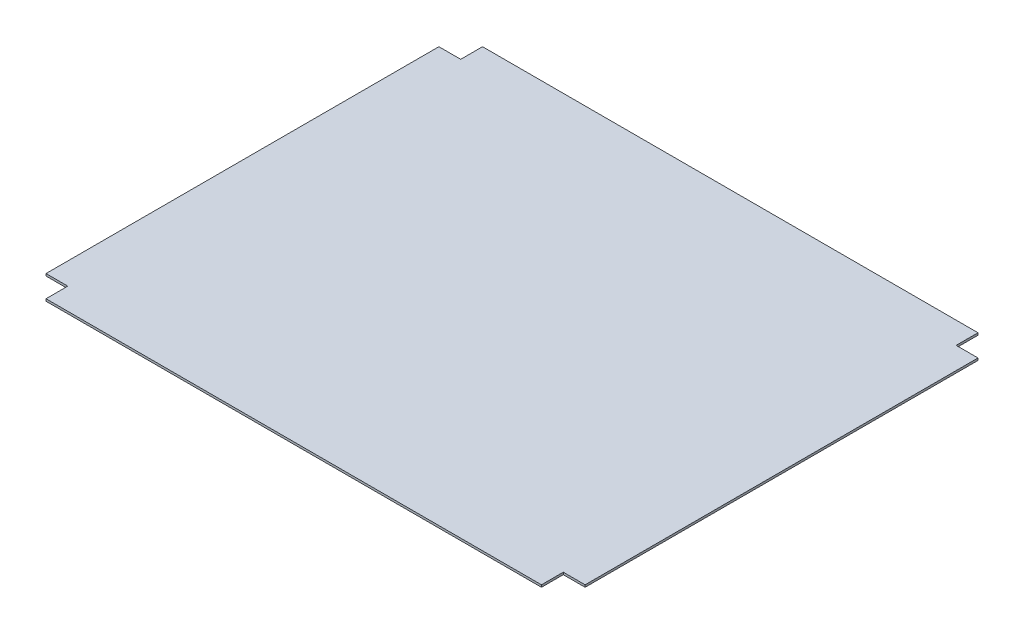
ISO-10303-21;
HEADER;
FILE_DESCRIPTION(('STEP AP214'),'2;1');
FILE_NAME('part.step','',(''),(''),'','','');
FILE_SCHEMA(('AUTOMOTIVE_DESIGN { 1 0 10303 214 1 1 1 1 }'));
ENDSEC;
DATA;
#1=APPLICATION_CONTEXT('core data for automotive mechanical design processes');
#2=APPLICATION_PROTOCOL_DEFINITION('international standard','automotive_design',2000,#1);
#3=PRODUCT_CONTEXT('',#1,'mechanical');
#4=PRODUCT('Part','Part','',(#3));
#5=PRODUCT_RELATED_PRODUCT_CATEGORY('part','',(#4));
#6=PRODUCT_DEFINITION_FORMATION('','',#4);
#7=PRODUCT_DEFINITION_CONTEXT('part definition',#1,'design');
#8=PRODUCT_DEFINITION('design','',#6,#7);
#9=PRODUCT_DEFINITION_SHAPE('','',#8);
#10=(LENGTH_UNIT() NAMED_UNIT(*) SI_UNIT(.MILLI.,.METRE.));
#11=(NAMED_UNIT(*) PLANE_ANGLE_UNIT() SI_UNIT($,.RADIAN.));
#12=(NAMED_UNIT(*) SI_UNIT($,.STERADIAN.) SOLID_ANGLE_UNIT());
#13=UNCERTAINTY_MEASURE_WITH_UNIT(LENGTH_MEASURE(1.E-05),#10,'distance_accuracy_value','');
#14=(GEOMETRIC_REPRESENTATION_CONTEXT(3) GLOBAL_UNCERTAINTY_ASSIGNED_CONTEXT((#13)) GLOBAL_UNIT_ASSIGNED_CONTEXT((#10,
#11,#12)) REPRESENTATION_CONTEXT('',''));
#15=CARTESIAN_POINT('',(0.,0.,0.));
#16=DIRECTION('',(0.,0.,1.));
#17=DIRECTION('',(1.,0.,0.));
#18=AXIS2_PLACEMENT_3D('',#15,#16,#17);
#19=CARTESIAN_POINT('',(-247.,-2.,0.));
#20=DIRECTION('',(-1.,0.,0.));
#21=DIRECTION('',(0.,0.,1.));
#22=AXIS2_PLACEMENT_3D('',#19,#20,#21);
#23=PLANE('',#22);
#24=DIRECTION('',(0.,1.,0.));
#25=VECTOR('',#24,1.);
#26=CARTESIAN_POINT('',(-247.,-10.,-20.));
#27=LINE('',#26,#25);
#28=CARTESIAN_POINT('',(-247.,-2.,-20.));
#29=VERTEX_POINT('',#28);
#30=CARTESIAN_POINT('',(-247.,0.,-20.));
#31=VERTEX_POINT('',#30);
#32=EDGE_CURVE('E139',#29,#31,#27,.T.);
#33=ORIENTED_EDGE('',*,*,#32,.T.);
#34=DIRECTION('',(0.,0.,1.));
#35=VECTOR('',#34,1.);
#36=CARTESIAN_POINT('',(-247.,0.,0.));
#37=LINE('',#36,#35);
#38=CARTESIAN_POINT('',(-247.,0.,-380.));
#39=VERTEX_POINT('',#38);
#40=EDGE_CURVE('E156',#39,#31,#37,.T.);
#41=ORIENTED_EDGE('',*,*,#40,.F.);
#42=DIRECTION('',(0.,1.,0.));
#43=VECTOR('',#42,1.);
#44=CARTESIAN_POINT('',(-247.,-10.,-380.));
#45=LINE('',#44,#43);
#46=CARTESIAN_POINT('',(-247.,-2.,-380.));
#47=VERTEX_POINT('',#46);
#48=EDGE_CURVE('E185',#47,#39,#45,.T.);
#49=ORIENTED_EDGE('',*,*,#48,.F.);
#50=DIRECTION('',(0.,0.,1.));
#51=VECTOR('',#50,1.);
#52=CARTESIAN_POINT('',(-247.,-2.,0.));
#53=LINE('',#52,#51);
#54=EDGE_CURVE('E207',#47,#29,#53,.T.);
#55=ORIENTED_EDGE('',*,*,#54,.T.);
#56=EDGE_LOOP('',(#33,#41,#49,#55));
#57=FACE_BOUND('',#56,.T.);
#58=ADVANCED_FACE('F38',(#57),#23,.T.);
#59=CARTESIAN_POINT('',(-247.,-2.,-400.));
#60=DIRECTION('',(0.,0.,-1.));
#61=DIRECTION('',(-1.,0.,0.));
#62=AXIS2_PLACEMENT_3D('',#59,#60,#61);
#63=PLANE('',#62);
#64=DIRECTION('',(0.,1.,0.));
#65=VECTOR('',#64,1.);
#66=CARTESIAN_POINT('',(227.,-10.,-400.));
#67=LINE('',#66,#65);
#68=CARTESIAN_POINT('',(227.,-2.,-400.));
#69=VERTEX_POINT('',#68);
#70=CARTESIAN_POINT('',(227.,0.,-400.));
#71=VERTEX_POINT('',#70);
#72=EDGE_CURVE('E54',#69,#71,#67,.T.);
#73=ORIENTED_EDGE('',*,*,#72,.F.);
#74=DIRECTION('',(-1.,0.,0.));
#75=VECTOR('',#74,1.);
#76=CARTESIAN_POINT('',(-247.,-2.,-400.));
#77=LINE('',#76,#75);
#78=CARTESIAN_POINT('',(-227.,-2.,-400.));
#79=VERTEX_POINT('',#78);
#80=EDGE_CURVE('E11',#69,#79,#77,.T.);
#81=ORIENTED_EDGE('',*,*,#80,.T.);
#82=DIRECTION('',(0.,1.,0.));
#83=VECTOR('',#82,1.);
#84=CARTESIAN_POINT('',(-227.,-10.,-400.));
#85=LINE('',#84,#83);
#86=CARTESIAN_POINT('',(-227.,0.,-400.));
#87=VERTEX_POINT('',#86);
#88=EDGE_CURVE('E186',#79,#87,#85,.T.);
#89=ORIENTED_EDGE('',*,*,#88,.T.);
#90=DIRECTION('',(-1.,0.,0.));
#91=VECTOR('',#90,1.);
#92=CARTESIAN_POINT('',(-247.,0.,-400.));
#93=LINE('',#92,#91);
#94=EDGE_CURVE('E41',#71,#87,#93,.T.);
#95=ORIENTED_EDGE('',*,*,#94,.F.);
#96=EDGE_LOOP('',(#73,#81,#89,#95));
#97=FACE_BOUND('',#96,.T.);
#98=ADVANCED_FACE('F224',(#97),#63,.T.);
#99=CARTESIAN_POINT('',(247.,-2.,0.));
#100=DIRECTION('',(1.,0.,0.));
#101=DIRECTION('',(0.,0.,-1.));
#102=AXIS2_PLACEMENT_3D('',#99,#100,#101);
#103=PLANE('',#102);
#104=DIRECTION('',(0.,1.,0.));
#105=VECTOR('',#104,1.);
#106=CARTESIAN_POINT('',(247.,-10.,-380.));
#107=LINE('',#106,#105);
#108=CARTESIAN_POINT('',(247.,-2.,-380.));
#109=VERTEX_POINT('',#108);
#110=CARTESIAN_POINT('',(247.,0.,-380.));
#111=VERTEX_POINT('',#110);
#112=EDGE_CURVE('E165',#109,#111,#107,.T.);
#113=ORIENTED_EDGE('',*,*,#112,.T.);
#114=DIRECTION('',(0.,0.,-1.));
#115=VECTOR('',#114,1.);
#116=CARTESIAN_POINT('',(247.,0.,0.));
#117=LINE('',#116,#115);
#118=CARTESIAN_POINT('',(247.,0.,-20.));
#119=VERTEX_POINT('',#118);
#120=EDGE_CURVE('E217',#119,#111,#117,.T.);
#121=ORIENTED_EDGE('',*,*,#120,.F.);
#122=DIRECTION('',(0.,1.,0.));
#123=VECTOR('',#122,1.);
#124=CARTESIAN_POINT('',(247.,-10.,-20.));
#125=LINE('',#124,#123);
#126=CARTESIAN_POINT('',(247.,-2.,-20.));
#127=VERTEX_POINT('',#126);
#128=EDGE_CURVE('E62',#127,#119,#125,.T.);
#129=ORIENTED_EDGE('',*,*,#128,.F.);
#130=DIRECTION('',(0.,0.,-1.));
#131=VECTOR('',#130,1.);
#132=CARTESIAN_POINT('',(247.,-2.,0.));
#133=LINE('',#132,#131);
#134=EDGE_CURVE('E46',#127,#109,#133,.T.);
#135=ORIENTED_EDGE('',*,*,#134,.T.);
#136=EDGE_LOOP('',(#113,#121,#129,#135));
#137=FACE_BOUND('',#136,.T.);
#138=ADVANCED_FACE('F265',(#137),#103,.T.);
#139=CARTESIAN_POINT('',(-247.,-2.,0.));
#140=DIRECTION('',(0.,0.,1.));
#141=DIRECTION('',(1.,0.,0.));
#142=AXIS2_PLACEMENT_3D('',#139,#140,#141);
#143=PLANE('',#142);
#144=DIRECTION('',(0.,1.,0.));
#145=VECTOR('',#144,1.);
#146=CARTESIAN_POINT('',(227.,-10.,0.));
#147=LINE('',#146,#145);
#148=CARTESIAN_POINT('',(227.,-2.,0.));
#149=VERTEX_POINT('',#148);
#150=CARTESIAN_POINT('',(227.,0.,0.));
#151=VERTEX_POINT('',#150);
#152=EDGE_CURVE('E149',#149,#151,#147,.T.);
#153=ORIENTED_EDGE('',*,*,#152,.T.);
#154=DIRECTION('',(1.,0.,0.));
#155=VECTOR('',#154,1.);
#156=CARTESIAN_POINT('',(-247.,0.,0.));
#157=LINE('',#156,#155);
#158=CARTESIAN_POINT('',(-227.,0.,0.));
#159=VERTEX_POINT('',#158);
#160=EDGE_CURVE('E216',#159,#151,#157,.T.);
#161=ORIENTED_EDGE('',*,*,#160,.F.);
#162=DIRECTION('',(0.,1.,0.));
#163=VECTOR('',#162,1.);
#164=CARTESIAN_POINT('',(-227.,-10.,1.11022302462516E-13));
#165=LINE('',#164,#163);
#166=CARTESIAN_POINT('',(-227.,-2.,1.11022302462516E-13));
#167=VERTEX_POINT('',#166);
#168=EDGE_CURVE('E140',#167,#159,#165,.T.);
#169=ORIENTED_EDGE('',*,*,#168,.F.);
#170=DIRECTION('',(1.,0.,0.));
#171=VECTOR('',#170,1.);
#172=CARTESIAN_POINT('',(-247.,-2.,0.));
#173=LINE('',#172,#171);
#174=EDGE_CURVE('E210',#167,#149,#173,.T.);
#175=ORIENTED_EDGE('',*,*,#174,.T.);
#176=EDGE_LOOP('',(#153,#161,#169,#175));
#177=FACE_BOUND('',#176,.T.);
#178=ADVANCED_FACE('F243',(#177),#143,.T.);
#179=CARTESIAN_POINT('',(0.,-2.,0.));
#180=DIRECTION('',(0.,-1.,0.));
#181=DIRECTION('',(0.,0.,-1.));
#182=AXIS2_PLACEMENT_3D('',#179,#180,#181);
#183=PLANE('',#182);
#184=DIRECTION('',(-1.,0.,0.));
#185=VECTOR('',#184,1.);
#186=CARTESIAN_POINT('',(0.,-2.,-380.));
#187=LINE('',#186,#185);
#188=CARTESIAN_POINT('',(227.,-2.,-380.));
#189=VERTEX_POINT('',#188);
#190=EDGE_CURVE('E205',#109,#189,#187,.T.);
#191=ORIENTED_EDGE('',*,*,#190,.F.);
#192=ORIENTED_EDGE('',*,*,#134,.F.);
#193=DIRECTION('',(1.,0.,0.));
#194=VECTOR('',#193,1.);
#195=CARTESIAN_POINT('',(0.,-2.,-20.));
#196=LINE('',#195,#194);
#197=CARTESIAN_POINT('',(227.,-2.,-20.));
#198=VERTEX_POINT('',#197);
#199=EDGE_CURVE('E199',#198,#127,#196,.T.);
#200=ORIENTED_EDGE('',*,*,#199,.F.);
#201=DIRECTION('',(0.,0.,-1.));
#202=VECTOR('',#201,1.);
#203=CARTESIAN_POINT('',(227.,-2.,-1.26010313294955E-12));
#204=LINE('',#203,#202);
#205=EDGE_CURVE('E201',#149,#198,#204,.T.);
#206=ORIENTED_EDGE('',*,*,#205,.F.);
#207=ORIENTED_EDGE('',*,*,#174,.F.);
#208=DIRECTION('',(0.,0.,1.));
#209=VECTOR('',#208,1.);
#210=CARTESIAN_POINT('',(-227.,-2.,0.));
#211=LINE('',#210,#209);
#212=CARTESIAN_POINT('',(-227.,-2.,-20.));
#213=VERTEX_POINT('',#212);
#214=EDGE_CURVE('E196',#213,#167,#211,.T.);
#215=ORIENTED_EDGE('',*,*,#214,.F.);
#216=DIRECTION('',(1.,0.,0.));
#217=VECTOR('',#216,1.);
#218=CARTESIAN_POINT('',(0.,-2.,-20.));
#219=LINE('',#218,#217);
#220=EDGE_CURVE('E136',#29,#213,#219,.T.);
#221=ORIENTED_EDGE('',*,*,#220,.F.);
#222=ORIENTED_EDGE('',*,*,#54,.F.);
#223=DIRECTION('',(-1.,0.,0.));
#224=VECTOR('',#223,1.);
#225=CARTESIAN_POINT('',(0.,-2.,-380.));
#226=LINE('',#225,#224);
#227=CARTESIAN_POINT('',(-227.,-2.,-380.));
#228=VERTEX_POINT('',#227);
#229=EDGE_CURVE('E189',#228,#47,#226,.T.);
#230=ORIENTED_EDGE('',*,*,#229,.F.);
#231=DIRECTION('',(0.,0.,1.));
#232=VECTOR('',#231,1.);
#233=CARTESIAN_POINT('',(-227.,-2.,0.));
#234=LINE('',#233,#232);
#235=EDGE_CURVE('E194',#79,#228,#234,.T.);
#236=ORIENTED_EDGE('',*,*,#235,.F.);
#237=ORIENTED_EDGE('',*,*,#80,.F.);
#238=DIRECTION('',(0.,0.,-1.));
#239=VECTOR('',#238,1.);
#240=CARTESIAN_POINT('',(226.999999999998,-2.,1.26010313294954E-12));
#241=LINE('',#240,#239);
#242=EDGE_CURVE('E203',#189,#69,#241,.T.);
#243=ORIENTED_EDGE('',*,*,#242,.F.);
#244=EDGE_LOOP('',(#191,#192,#200,#206,#207,#215,#221,#222,#230,#236,#237,#243));
#245=FACE_BOUND('',#244,.T.);
#246=ADVANCED_FACE('F233',(#245),#183,.T.);
#247=CARTESIAN_POINT('',(0.,0.,0.));
#248=DIRECTION('',(0.,-1.,0.));
#249=DIRECTION('',(0.,0.,-1.));
#250=AXIS2_PLACEMENT_3D('',#247,#248,#249);
#251=PLANE('',#250);
#252=ORIENTED_EDGE('',*,*,#120,.T.);
#253=DIRECTION('',(1.,0.,0.));
#254=VECTOR('',#253,1.);
#255=CARTESIAN_POINT('',(247.,0.,-380.));
#256=LINE('',#255,#254);
#257=CARTESIAN_POINT('',(227.,0.,-380.));
#258=VERTEX_POINT('',#257);
#259=EDGE_CURVE('E174',#258,#111,#256,.T.);
#260=ORIENTED_EDGE('',*,*,#259,.F.);
#261=DIRECTION('',(0.,0.,1.));
#262=VECTOR('',#261,1.);
#263=CARTESIAN_POINT('',(227.,0.,-400.));
#264=LINE('',#263,#262);
#265=EDGE_CURVE('E172',#71,#258,#264,.T.);
#266=ORIENTED_EDGE('',*,*,#265,.F.);
#267=ORIENTED_EDGE('',*,*,#94,.T.);
#268=DIRECTION('',(0.,0.,-1.));
#269=VECTOR('',#268,1.);
#270=CARTESIAN_POINT('',(-227.,0.,-400.));
#271=LINE('',#270,#269);
#272=CARTESIAN_POINT('',(-227.,0.,-380.));
#273=VERTEX_POINT('',#272);
#274=EDGE_CURVE('E183',#273,#87,#271,.T.);
#275=ORIENTED_EDGE('',*,*,#274,.F.);
#276=DIRECTION('',(1.,0.,0.));
#277=VECTOR('',#276,1.);
#278=CARTESIAN_POINT('',(-247.,0.,-380.));
#279=LINE('',#278,#277);
#280=EDGE_CURVE('E160',#39,#273,#279,.T.);
#281=ORIENTED_EDGE('',*,*,#280,.F.);
#282=ORIENTED_EDGE('',*,*,#40,.T.);
#283=DIRECTION('',(-1.,0.,0.));
#284=VECTOR('',#283,1.);
#285=CARTESIAN_POINT('',(-247.,0.,-20.));
#286=LINE('',#285,#284);
#287=CARTESIAN_POINT('',(-227.,0.,-20.));
#288=VERTEX_POINT('',#287);
#289=EDGE_CURVE('E133',#288,#31,#286,.T.);
#290=ORIENTED_EDGE('',*,*,#289,.F.);
#291=DIRECTION('',(0.,0.,-1.));
#292=VECTOR('',#291,1.);
#293=CARTESIAN_POINT('',(-227.,0.,1.11022302462516E-13));
#294=LINE('',#293,#292);
#295=EDGE_CURVE('E143',#159,#288,#294,.T.);
#296=ORIENTED_EDGE('',*,*,#295,.F.);
#297=ORIENTED_EDGE('',*,*,#160,.T.);
#298=DIRECTION('',(0.,0.,1.));
#299=VECTOR('',#298,1.);
#300=CARTESIAN_POINT('',(227.,0.,0.));
#301=LINE('',#300,#299);
#302=CARTESIAN_POINT('',(227.,0.,-20.));
#303=VERTEX_POINT('',#302);
#304=EDGE_CURVE('E164',#303,#151,#301,.T.);
#305=ORIENTED_EDGE('',*,*,#304,.F.);
#306=DIRECTION('',(-1.,0.,0.));
#307=VECTOR('',#306,1.);
#308=CARTESIAN_POINT('',(247.,0.,-20.));
#309=LINE('',#308,#307);
#310=EDGE_CURVE('E162',#119,#303,#309,.T.);
#311=ORIENTED_EDGE('',*,*,#310,.F.);
#312=EDGE_LOOP('',(#252,#260,#266,#267,#275,#281,#282,#290,#296,#297,#305,#311));
#313=FACE_BOUND('',#312,.T.);
#314=ADVANCED_FACE('F153',(#313),#251,.F.);
#315=CARTESIAN_POINT('',(-227.,-10.,-400.));
#316=DIRECTION('',(1.,0.,0.));
#317=DIRECTION('',(0.,0.,-1.));
#318=AXIS2_PLACEMENT_3D('',#315,#316,#317);
#319=PLANE('',#318);
#320=ORIENTED_EDGE('',*,*,#235,.T.);
#321=DIRECTION('',(0.,1.,0.));
#322=VECTOR('',#321,1.);
#323=CARTESIAN_POINT('',(-227.,-10.,-380.));
#324=LINE('',#323,#322);
#325=EDGE_CURVE('E190',#228,#273,#324,.T.);
#326=ORIENTED_EDGE('',*,*,#325,.T.);
#327=ORIENTED_EDGE('',*,*,#274,.T.);
#328=ORIENTED_EDGE('',*,*,#88,.F.);
#329=EDGE_LOOP('',(#320,#326,#327,#328));
#330=FACE_BOUND('',#329,.T.);
#331=ADVANCED_FACE('F228',(#330),#319,.F.);
#332=CARTESIAN_POINT('',(-247.,-10.,-380.));
#333=DIRECTION('',(0.,0.,1.));
#334=DIRECTION('',(1.,0.,0.));
#335=AXIS2_PLACEMENT_3D('',#332,#333,#334);
#336=PLANE('',#335);
#337=ORIENTED_EDGE('',*,*,#229,.T.);
#338=ORIENTED_EDGE('',*,*,#48,.T.);
#339=ORIENTED_EDGE('',*,*,#280,.T.);
#340=ORIENTED_EDGE('',*,*,#325,.F.);
#341=EDGE_LOOP('',(#337,#338,#339,#340));
#342=FACE_BOUND('',#341,.T.);
#343=ADVANCED_FACE('F238',(#342),#336,.F.);
#344=CARTESIAN_POINT('',(-247.,-10.,-20.));
#345=DIRECTION('',(0.,0.,-1.));
#346=DIRECTION('',(-1.,0.,0.));
#347=AXIS2_PLACEMENT_3D('',#344,#345,#346);
#348=PLANE('',#347);
#349=ORIENTED_EDGE('',*,*,#220,.T.);
#350=DIRECTION('',(0.,1.,0.));
#351=VECTOR('',#350,1.);
#352=CARTESIAN_POINT('',(-227.,-10.,-20.));
#353=LINE('',#352,#351);
#354=EDGE_CURVE('E129',#213,#288,#353,.T.);
#355=ORIENTED_EDGE('',*,*,#354,.T.);
#356=ORIENTED_EDGE('',*,*,#289,.T.);
#357=ORIENTED_EDGE('',*,*,#32,.F.);
#358=EDGE_LOOP('',(#349,#355,#356,#357));
#359=FACE_BOUND('',#358,.T.);
#360=ADVANCED_FACE('F131',(#359),#348,.F.);
#361=CARTESIAN_POINT('',(-227.,-10.,1.11022302462516E-13));
#362=DIRECTION('',(1.,0.,0.));
#363=DIRECTION('',(0.,0.,-1.));
#364=AXIS2_PLACEMENT_3D('',#361,#362,#363);
#365=PLANE('',#364);
#366=ORIENTED_EDGE('',*,*,#214,.T.);
#367=ORIENTED_EDGE('',*,*,#168,.T.);
#368=ORIENTED_EDGE('',*,*,#295,.T.);
#369=ORIENTED_EDGE('',*,*,#354,.F.);
#370=EDGE_LOOP('',(#366,#367,#368,#369));
#371=FACE_BOUND('',#370,.T.);
#372=ADVANCED_FACE('F144',(#371),#365,.F.);
#373=CARTESIAN_POINT('',(227.,-10.,0.));
#374=DIRECTION('',(-1.,0.,0.));
#375=DIRECTION('',(0.,0.,1.));
#376=AXIS2_PLACEMENT_3D('',#373,#374,#375);
#377=PLANE('',#376);
#378=ORIENTED_EDGE('',*,*,#205,.T.);
#379=DIRECTION('',(0.,1.,0.));
#380=VECTOR('',#379,1.);
#381=CARTESIAN_POINT('',(227.,-10.,-20.));
#382=LINE('',#381,#380);
#383=EDGE_CURVE('E169',#198,#303,#382,.T.);
#384=ORIENTED_EDGE('',*,*,#383,.T.);
#385=ORIENTED_EDGE('',*,*,#304,.T.);
#386=ORIENTED_EDGE('',*,*,#152,.F.);
#387=EDGE_LOOP('',(#378,#384,#385,#386));
#388=FACE_BOUND('',#387,.T.);
#389=ADVANCED_FACE('F246',(#388),#377,.F.);
#390=CARTESIAN_POINT('',(247.,-10.,-20.));
#391=DIRECTION('',(0.,0.,-1.));
#392=DIRECTION('',(-1.,0.,0.));
#393=AXIS2_PLACEMENT_3D('',#390,#391,#392);
#394=PLANE('',#393);
#395=ORIENTED_EDGE('',*,*,#199,.T.);
#396=ORIENTED_EDGE('',*,*,#128,.T.);
#397=ORIENTED_EDGE('',*,*,#310,.T.);
#398=ORIENTED_EDGE('',*,*,#383,.F.);
#399=EDGE_LOOP('',(#395,#396,#397,#398));
#400=FACE_BOUND('',#399,.T.);
#401=ADVANCED_FACE('F249',(#400),#394,.F.);
#402=CARTESIAN_POINT('',(247.,-10.,-380.));
#403=DIRECTION('',(0.,0.,1.));
#404=DIRECTION('',(1.,0.,0.));
#405=AXIS2_PLACEMENT_3D('',#402,#403,#404);
#406=PLANE('',#405);
#407=ORIENTED_EDGE('',*,*,#190,.T.);
#408=DIRECTION('',(0.,1.,0.));
#409=VECTOR('',#408,1.);
#410=CARTESIAN_POINT('',(227.,-10.,-380.));
#411=LINE('',#410,#409);
#412=EDGE_CURVE('E178',#189,#258,#411,.T.);
#413=ORIENTED_EDGE('',*,*,#412,.T.);
#414=ORIENTED_EDGE('',*,*,#259,.T.);
#415=ORIENTED_EDGE('',*,*,#112,.F.);
#416=EDGE_LOOP('',(#407,#413,#414,#415));
#417=FACE_BOUND('',#416,.T.);
#418=ADVANCED_FACE('F251',(#417),#406,.F.);
#419=CARTESIAN_POINT('',(227.,-10.,-400.));
#420=DIRECTION('',(-1.,0.,0.));
#421=DIRECTION('',(0.,0.,1.));
#422=AXIS2_PLACEMENT_3D('',#419,#420,#421);
#423=PLANE('',#422);
#424=ORIENTED_EDGE('',*,*,#242,.T.);
#425=ORIENTED_EDGE('',*,*,#72,.T.);
#426=ORIENTED_EDGE('',*,*,#265,.T.);
#427=ORIENTED_EDGE('',*,*,#412,.F.);
#428=EDGE_LOOP('',(#424,#425,#426,#427));
#429=FACE_BOUND('',#428,.T.);
#430=ADVANCED_FACE('F257',(#429),#423,.F.);
#431=CLOSED_SHELL('',(#58,#98,#138,#178,#246,#314,#331,#343,#360,#372,#389,#401,#418,#430));
#432=MANIFOLD_SOLID_BREP('B2',#431);
#433=ADVANCED_BREP_SHAPE_REPRESENTATION('',(#18,#432),#14);
#434=SHAPE_DEFINITION_REPRESENTATION(#9,#433);
ENDSEC;
END-ISO-10303-21;
